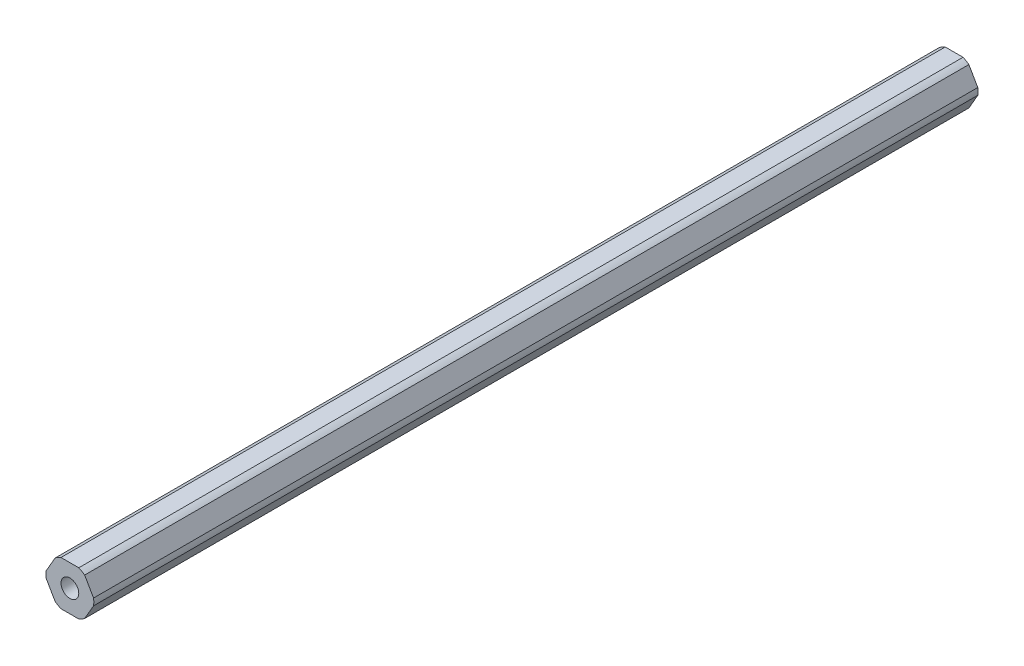
ISO-10303-21;
HEADER;
FILE_DESCRIPTION(('STEP AP214'),'2;1');
FILE_NAME('part.step','',(''),(''),'','','');
FILE_SCHEMA(('AUTOMOTIVE_DESIGN { 1 0 10303 214 1 1 1 1 }'));
ENDSEC;
DATA;
#1=APPLICATION_CONTEXT('core data for automotive mechanical design processes');
#2=APPLICATION_PROTOCOL_DEFINITION('international standard','automotive_design',2000,#1);
#3=PRODUCT_CONTEXT('',#1,'mechanical');
#4=PRODUCT('Part','Part','',(#3));
#5=PRODUCT_RELATED_PRODUCT_CATEGORY('part','',(#4));
#6=PRODUCT_DEFINITION_FORMATION('','',#4);
#7=PRODUCT_DEFINITION_CONTEXT('part definition',#1,'design');
#8=PRODUCT_DEFINITION('design','',#6,#7);
#9=PRODUCT_DEFINITION_SHAPE('','',#8);
#10=(LENGTH_UNIT() NAMED_UNIT(*) SI_UNIT(.MILLI.,.METRE.));
#11=(NAMED_UNIT(*) PLANE_ANGLE_UNIT() SI_UNIT($,.RADIAN.));
#12=(NAMED_UNIT(*) SI_UNIT($,.STERADIAN.) SOLID_ANGLE_UNIT());
#13=UNCERTAINTY_MEASURE_WITH_UNIT(LENGTH_MEASURE(1.E-05),#10,'distance_accuracy_value','');
#14=(GEOMETRIC_REPRESENTATION_CONTEXT(3) GLOBAL_UNCERTAINTY_ASSIGNED_CONTEXT((#13)) GLOBAL_UNIT_ASSIGNED_CONTEXT((#10,
#11,#12)) REPRESENTATION_CONTEXT('',''));
#15=CARTESIAN_POINT('',(0.,0.,0.));
#16=DIRECTION('',(0.,0.,1.));
#17=DIRECTION('',(1.,0.,0.));
#18=AXIS2_PLACEMENT_3D('',#15,#16,#17);
#19=CARTESIAN_POINT('',(0.,0.,-228.6));
#20=DIRECTION('',(0.,0.,1.));
#21=DIRECTION('',(1.,0.,0.));
#22=AXIS2_PLACEMENT_3D('',#19,#20,#21);
#23=CYLINDRICAL_SURFACE('',#22,6.87);
#24=CARTESIAN_POINT('',(0.,0.,-25.4));
#25=DIRECTION('',(0.,0.,1.));
#26=DIRECTION('',(1.,0.,0.));
#27=AXIS2_PLACEMENT_3D('',#24,#25,#26);
#28=CIRCLE('',#27,6.87);
#29=CARTESIAN_POINT('',(6.80102150534208,0.97108520937895,-25.4));
#30=VERTEX_POINT('',#29);
#31=CARTESIAN_POINT('',(6.80102150534208,-0.971085209378955,-25.4));
#32=VERTEX_POINT('',#31);
#33=EDGE_CURVE('E158',#30,#32,#28,.F.);
#34=ORIENTED_EDGE('',*,*,#33,.F.);
#35=DIRECTION('',(0.,0.,1.));
#36=VECTOR('',#35,1.);
#37=CARTESIAN_POINT('',(6.80102150534208,0.97108520937895,228.6));
#38=LINE('',#37,#36);
#39=CARTESIAN_POINT('',(6.80102150534208,0.971085209378948,228.6));
#40=VERTEX_POINT('',#39);
#41=EDGE_CURVE('E142',#30,#40,#38,.T.);
#42=ORIENTED_EDGE('',*,*,#41,.T.);
#43=CARTESIAN_POINT('',(0.,0.,228.6));
#44=DIRECTION('',(0.,0.,1.));
#45=DIRECTION('',(1.,0.,0.));
#46=AXIS2_PLACEMENT_3D('',#43,#44,#45);
#47=CIRCLE('',#46,6.87);
#48=CARTESIAN_POINT('',(6.80102150534208,-0.971085209378954,228.6));
#49=VERTEX_POINT('',#48);
#50=EDGE_CURVE('E178',#40,#49,#47,.F.);
#51=ORIENTED_EDGE('',*,*,#50,.T.);
#52=DIRECTION('',(0.,0.,1.));
#53=VECTOR('',#52,1.);
#54=CARTESIAN_POINT('',(6.80102150534208,-0.971085209378955,228.6));
#55=LINE('',#54,#53);
#56=EDGE_CURVE('E202',#49,#32,#55,.F.);
#57=ORIENTED_EDGE('',*,*,#56,.T.);
#58=EDGE_LOOP('',(#34,#42,#51,#57));
#59=FACE_BOUND('',#58,.T.);
#60=ADVANCED_FACE('F39',(#59),#23,.T.);
#61=CARTESIAN_POINT('',(3.68083890619154,6.3754,228.6));
#62=DIRECTION('',(0.,-1.,0.));
#63=DIRECTION('',(1.,0.,0.));
#64=AXIS2_PLACEMENT_3D('',#61,#62,#63);
#65=PLANE('',#64);
#66=DIRECTION('',(0.,0.,1.));
#67=VECTOR('',#66,1.);
#68=CARTESIAN_POINT('',(2.55952629210953,6.37540000000001,-228.6));
#69=LINE('',#68,#67);
#70=CARTESIAN_POINT('',(2.55952629210953,6.37540000000001,-25.4));
#71=VERTEX_POINT('',#70);
#72=CARTESIAN_POINT('',(2.55952629210953,6.37540000000001,228.6));
#73=VERTEX_POINT('',#72);
#74=EDGE_CURVE('E141',#71,#73,#69,.T.);
#75=ORIENTED_EDGE('',*,*,#74,.F.);
#76=DIRECTION('',(-1.,0.,0.));
#77=VECTOR('',#76,1.);
#78=CARTESIAN_POINT('',(3.68083890619154,6.3754,-25.4));
#79=LINE('',#78,#77);
#80=CARTESIAN_POINT('',(-2.55952629210953,6.37540000000001,-25.4));
#81=VERTEX_POINT('',#80);
#82=EDGE_CURVE('E55',#71,#81,#79,.T.);
#83=ORIENTED_EDGE('',*,*,#82,.T.);
#84=DIRECTION('',(0.,0.,1.));
#85=VECTOR('',#84,1.);
#86=CARTESIAN_POINT('',(-2.55952629210953,6.37540000000001,-228.6));
#87=LINE('',#86,#85);
#88=CARTESIAN_POINT('',(-2.55952629210953,6.37540000000001,228.6));
#89=VERTEX_POINT('',#88);
#90=EDGE_CURVE('E227',#89,#81,#87,.F.);
#91=ORIENTED_EDGE('',*,*,#90,.F.);
#92=DIRECTION('',(1.,0.,0.));
#93=VECTOR('',#92,1.);
#94=CARTESIAN_POINT('',(0.,6.3754,228.6));
#95=LINE('',#94,#93);
#96=EDGE_CURVE('E191',#73,#89,#95,.F.);
#97=ORIENTED_EDGE('',*,*,#96,.F.);
#98=EDGE_LOOP('',(#75,#83,#91,#97));
#99=FACE_BOUND('',#98,.T.);
#100=ADVANCED_FACE('F277',(#99),#65,.F.);
#101=CARTESIAN_POINT('',(0.,0.,-228.6));
#102=DIRECTION('',(0.,0.,1.));
#103=DIRECTION('',(1.,0.,0.));
#104=AXIS2_PLACEMENT_3D('',#101,#102,#103);
#105=CYLINDRICAL_SURFACE('',#104,6.87);
#106=CARTESIAN_POINT('',(0.,0.,-25.4));
#107=DIRECTION('',(0.,0.,1.));
#108=DIRECTION('',(1.,0.,0.));
#109=AXIS2_PLACEMENT_3D('',#106,#107,#108);
#110=CIRCLE('',#109,6.87);
#111=CARTESIAN_POINT('',(-4.24149521323255,5.40431479062104,-25.4));
#112=VERTEX_POINT('',#111);
#113=EDGE_CURVE('E62',#112,#81,#110,.F.);
#114=ORIENTED_EDGE('',*,*,#113,.F.);
#115=DIRECTION('',(0.,0.,1.));
#116=VECTOR('',#115,1.);
#117=CARTESIAN_POINT('',(-4.24149521323255,5.40431479062104,228.6));
#118=LINE('',#117,#116);
#119=CARTESIAN_POINT('',(-4.24149521323255,5.40431479062105,228.6));
#120=VERTEX_POINT('',#119);
#121=EDGE_CURVE('E224',#112,#120,#118,.T.);
#122=ORIENTED_EDGE('',*,*,#121,.T.);
#123=CARTESIAN_POINT('',(0.,0.,228.6));
#124=DIRECTION('',(0.,0.,1.));
#125=DIRECTION('',(1.,0.,0.));
#126=AXIS2_PLACEMENT_3D('',#123,#124,#125);
#127=CIRCLE('',#126,6.87);
#128=EDGE_CURVE('E190',#89,#120,#127,.T.);
#129=ORIENTED_EDGE('',*,*,#128,.F.);
#130=ORIENTED_EDGE('',*,*,#90,.T.);
#131=EDGE_LOOP('',(#114,#122,#129,#130));
#132=FACE_BOUND('',#131,.T.);
#133=ADVANCED_FACE('F275',(#132),#105,.T.);
#134=CARTESIAN_POINT('',(-3.68083890619154,6.3754,228.6));
#135=DIRECTION('',(0.866025403784439,-0.5,0.));
#136=DIRECTION('',(0.5,0.866025403784439,0.));
#137=AXIS2_PLACEMENT_3D('',#134,#135,#136);
#138=PLANE('',#137);
#139=ORIENTED_EDGE('',*,*,#121,.F.);
#140=DIRECTION('',(-0.5,-0.866025403784439,0.));
#141=VECTOR('',#140,1.);
#142=CARTESIAN_POINT('',(-3.68083890619154,6.3754,-25.4));
#143=LINE('',#142,#141);
#144=CARTESIAN_POINT('',(-6.80102150534208,0.971085209378959,-25.4));
#145=VERTEX_POINT('',#144);
#146=EDGE_CURVE('E175',#112,#145,#143,.T.);
#147=ORIENTED_EDGE('',*,*,#146,.T.);
#148=DIRECTION('',(0.,0.,1.));
#149=VECTOR('',#148,1.);
#150=CARTESIAN_POINT('',(-6.80102150534208,0.971085209378959,-228.6));
#151=LINE('',#150,#149);
#152=CARTESIAN_POINT('',(-6.80102150534208,0.971085209378961,228.6));
#153=VERTEX_POINT('',#152);
#154=EDGE_CURVE('E220',#153,#145,#151,.F.);
#155=ORIENTED_EDGE('',*,*,#154,.F.);
#156=DIRECTION('',(-0.5,-0.866025403784439,0.));
#157=VECTOR('',#156,1.);
#158=CARTESIAN_POINT('',(-4.24149521323255,5.40431479062104,228.6));
#159=LINE('',#158,#157);
#160=EDGE_CURVE('E188',#120,#153,#159,.T.);
#161=ORIENTED_EDGE('',*,*,#160,.F.);
#162=EDGE_LOOP('',(#139,#147,#155,#161));
#163=FACE_BOUND('',#162,.T.);
#164=ADVANCED_FACE('F273',(#163),#138,.F.);
#165=CARTESIAN_POINT('',(0.,0.,-228.6));
#166=DIRECTION('',(0.,0.,1.));
#167=DIRECTION('',(1.,0.,0.));
#168=AXIS2_PLACEMENT_3D('',#165,#166,#167);
#169=CYLINDRICAL_SURFACE('',#168,6.87);
#170=CARTESIAN_POINT('',(0.,0.,-25.4));
#171=DIRECTION('',(0.,0.,1.));
#172=DIRECTION('',(1.,0.,0.));
#173=AXIS2_PLACEMENT_3D('',#170,#171,#172);
#174=CIRCLE('',#173,6.87);
#175=CARTESIAN_POINT('',(-6.80102150534208,-0.971085209378956,-25.4));
#176=VERTEX_POINT('',#175);
#177=EDGE_CURVE('E172',#176,#145,#174,.F.);
#178=ORIENTED_EDGE('',*,*,#177,.F.);
#179=DIRECTION('',(0.,0.,1.));
#180=VECTOR('',#179,1.);
#181=CARTESIAN_POINT('',(-6.80102150534208,-0.971085209378956,228.6));
#182=LINE('',#181,#180);
#183=CARTESIAN_POINT('',(-6.80102150534208,-0.971085209378955,228.6));
#184=VERTEX_POINT('',#183);
#185=EDGE_CURVE('E217',#176,#184,#182,.T.);
#186=ORIENTED_EDGE('',*,*,#185,.T.);
#187=CARTESIAN_POINT('',(0.,0.,228.6));
#188=DIRECTION('',(0.,0.,1.));
#189=DIRECTION('',(1.,0.,0.));
#190=AXIS2_PLACEMENT_3D('',#187,#188,#189);
#191=CIRCLE('',#190,6.87);
#192=EDGE_CURVE('E187',#153,#184,#191,.T.);
#193=ORIENTED_EDGE('',*,*,#192,.F.);
#194=ORIENTED_EDGE('',*,*,#154,.T.);
#195=EDGE_LOOP('',(#178,#186,#193,#194));
#196=FACE_BOUND('',#195,.T.);
#197=ADVANCED_FACE('F269',(#196),#169,.T.);
#198=CARTESIAN_POINT('',(-7.36167781238308,0.,228.6));
#199=DIRECTION('',(0.866025403784439,0.5,0.));
#200=DIRECTION('',(-0.5,0.866025403784439,0.));
#201=AXIS2_PLACEMENT_3D('',#198,#199,#200);
#202=PLANE('',#201);
#203=ORIENTED_EDGE('',*,*,#185,.F.);
#204=DIRECTION('',(0.5,-0.866025403784439,0.));
#205=VECTOR('',#204,1.);
#206=CARTESIAN_POINT('',(-7.36167781238308,0.,-25.4));
#207=LINE('',#206,#205);
#208=CARTESIAN_POINT('',(-4.24149521323255,-5.40431479062105,-25.4));
#209=VERTEX_POINT('',#208);
#210=EDGE_CURVE('E170',#176,#209,#207,.T.);
#211=ORIENTED_EDGE('',*,*,#210,.T.);
#212=DIRECTION('',(0.,0.,1.));
#213=VECTOR('',#212,1.);
#214=CARTESIAN_POINT('',(-4.24149521323255,-5.40431479062105,-228.6));
#215=LINE('',#214,#213);
#216=CARTESIAN_POINT('',(-4.24149521323255,-5.40431479062105,228.6));
#217=VERTEX_POINT('',#216);
#218=EDGE_CURVE('E213',#217,#209,#215,.F.);
#219=ORIENTED_EDGE('',*,*,#218,.F.);
#220=DIRECTION('',(0.5,-0.866025403784439,0.));
#221=VECTOR('',#220,1.);
#222=CARTESIAN_POINT('',(-6.80102150534208,-0.971085209378956,228.6));
#223=LINE('',#222,#221);
#224=EDGE_CURVE('E185',#184,#217,#223,.T.);
#225=ORIENTED_EDGE('',*,*,#224,.F.);
#226=EDGE_LOOP('',(#203,#211,#219,#225));
#227=FACE_BOUND('',#226,.T.);
#228=ADVANCED_FACE('F267',(#227),#202,.F.);
#229=CARTESIAN_POINT('',(0.,0.,-228.6));
#230=DIRECTION('',(0.,0.,1.));
#231=DIRECTION('',(1.,0.,0.));
#232=AXIS2_PLACEMENT_3D('',#229,#230,#231);
#233=CYLINDRICAL_SURFACE('',#232,6.87);
#234=CARTESIAN_POINT('',(0.,0.,-25.4));
#235=DIRECTION('',(0.,0.,1.));
#236=DIRECTION('',(1.,0.,0.));
#237=AXIS2_PLACEMENT_3D('',#234,#235,#236);
#238=CIRCLE('',#237,6.87);
#239=CARTESIAN_POINT('',(-2.55952629210953,-6.3754,-25.4));
#240=VERTEX_POINT('',#239);
#241=EDGE_CURVE('E167',#240,#209,#238,.F.);
#242=ORIENTED_EDGE('',*,*,#241,.F.);
#243=DIRECTION('',(0.,0.,1.));
#244=VECTOR('',#243,1.);
#245=CARTESIAN_POINT('',(-2.55952629210953,-6.3754,228.6));
#246=LINE('',#245,#244);
#247=CARTESIAN_POINT('',(-2.55952629210953,-6.3754,228.6));
#248=VERTEX_POINT('',#247);
#249=EDGE_CURVE('E210',#240,#248,#246,.T.);
#250=ORIENTED_EDGE('',*,*,#249,.T.);
#251=CARTESIAN_POINT('',(0.,0.,228.6));
#252=DIRECTION('',(0.,0.,1.));
#253=DIRECTION('',(1.,0.,0.));
#254=AXIS2_PLACEMENT_3D('',#251,#252,#253);
#255=CIRCLE('',#254,6.87);
#256=EDGE_CURVE('E184',#217,#248,#255,.T.);
#257=ORIENTED_EDGE('',*,*,#256,.F.);
#258=ORIENTED_EDGE('',*,*,#218,.T.);
#259=EDGE_LOOP('',(#242,#250,#257,#258));
#260=FACE_BOUND('',#259,.T.);
#261=ADVANCED_FACE('F261',(#260),#233,.T.);
#262=CARTESIAN_POINT('',(-3.68083890619154,-6.3754,228.6));
#263=DIRECTION('',(0.,1.,0.));
#264=DIRECTION('',(0.,0.,1.));
#265=AXIS2_PLACEMENT_3D('',#262,#263,#264);
#266=PLANE('',#265);
#267=ORIENTED_EDGE('',*,*,#249,.F.);
#268=DIRECTION('',(1.,0.,0.));
#269=VECTOR('',#268,1.);
#270=CARTESIAN_POINT('',(-3.68083890619154,-6.3754,-25.4));
#271=LINE('',#270,#269);
#272=CARTESIAN_POINT('',(2.55952629210953,-6.3754,-25.4));
#273=VERTEX_POINT('',#272);
#274=EDGE_CURVE('E165',#240,#273,#271,.T.);
#275=ORIENTED_EDGE('',*,*,#274,.T.);
#276=DIRECTION('',(0.,0.,1.));
#277=VECTOR('',#276,1.);
#278=CARTESIAN_POINT('',(2.55952629210953,-6.3754,-228.6));
#279=LINE('',#278,#277);
#280=CARTESIAN_POINT('',(2.55952629210953,-6.3754,228.6));
#281=VERTEX_POINT('',#280);
#282=EDGE_CURVE('E206',#281,#273,#279,.F.);
#283=ORIENTED_EDGE('',*,*,#282,.F.);
#284=DIRECTION('',(1.,0.,0.));
#285=VECTOR('',#284,1.);
#286=CARTESIAN_POINT('',(0.,-6.3754,228.6));
#287=LINE('',#286,#285);
#288=EDGE_CURVE('E182',#248,#281,#287,.T.);
#289=ORIENTED_EDGE('',*,*,#288,.F.);
#290=EDGE_LOOP('',(#267,#275,#283,#289));
#291=FACE_BOUND('',#290,.T.);
#292=ADVANCED_FACE('F258',(#291),#266,.F.);
#293=CARTESIAN_POINT('',(0.,0.,-228.6));
#294=DIRECTION('',(0.,0.,1.));
#295=DIRECTION('',(1.,0.,0.));
#296=AXIS2_PLACEMENT_3D('',#293,#294,#295);
#297=CYLINDRICAL_SURFACE('',#296,6.87);
#298=CARTESIAN_POINT('',(0.,0.,-25.4));
#299=DIRECTION('',(0.,0.,1.));
#300=DIRECTION('',(1.,0.,0.));
#301=AXIS2_PLACEMENT_3D('',#298,#299,#300);
#302=CIRCLE('',#301,6.87);
#303=CARTESIAN_POINT('',(4.24149521323254,-5.40431479062105,-25.4));
#304=VERTEX_POINT('',#303);
#305=EDGE_CURVE('E162',#304,#273,#302,.F.);
#306=ORIENTED_EDGE('',*,*,#305,.F.);
#307=DIRECTION('',(0.,0.,1.));
#308=VECTOR('',#307,1.);
#309=CARTESIAN_POINT('',(4.24149521323254,-5.40431479062105,228.6));
#310=LINE('',#309,#308);
#311=CARTESIAN_POINT('',(4.24149521323254,-5.40431479062105,228.6));
#312=VERTEX_POINT('',#311);
#313=EDGE_CURVE('E199',#304,#312,#310,.T.);
#314=ORIENTED_EDGE('',*,*,#313,.T.);
#315=CARTESIAN_POINT('',(0.,0.,228.6));
#316=DIRECTION('',(0.,0.,1.));
#317=DIRECTION('',(1.,0.,0.));
#318=AXIS2_PLACEMENT_3D('',#315,#316,#317);
#319=CIRCLE('',#318,6.87);
#320=EDGE_CURVE('E181',#281,#312,#319,.T.);
#321=ORIENTED_EDGE('',*,*,#320,.F.);
#322=ORIENTED_EDGE('',*,*,#282,.T.);
#323=EDGE_LOOP('',(#306,#314,#321,#322));
#324=FACE_BOUND('',#323,.T.);
#325=ADVANCED_FACE('F253',(#324),#297,.T.);
#326=CARTESIAN_POINT('',(3.68083890619154,-6.3754,228.6));
#327=DIRECTION('',(-0.866025403784439,0.5,0.));
#328=DIRECTION('',(-0.5,-0.866025403784439,0.));
#329=AXIS2_PLACEMENT_3D('',#326,#327,#328);
#330=PLANE('',#329);
#331=ORIENTED_EDGE('',*,*,#313,.F.);
#332=DIRECTION('',(0.5,0.866025403784439,0.));
#333=VECTOR('',#332,1.);
#334=CARTESIAN_POINT('',(3.68083890619154,-6.3754,-25.4));
#335=LINE('',#334,#333);
#336=EDGE_CURVE('E160',#304,#32,#335,.T.);
#337=ORIENTED_EDGE('',*,*,#336,.T.);
#338=ORIENTED_EDGE('',*,*,#56,.F.);
#339=DIRECTION('',(0.5,0.866025403784439,0.));
#340=VECTOR('',#339,1.);
#341=CARTESIAN_POINT('',(4.24149521323254,-5.40431479062105,228.6));
#342=LINE('',#341,#340);
#343=EDGE_CURVE('E47',#312,#49,#342,.T.);
#344=ORIENTED_EDGE('',*,*,#343,.F.);
#345=EDGE_LOOP('',(#331,#337,#338,#344));
#346=FACE_BOUND('',#345,.T.);
#347=ADVANCED_FACE('F245',(#346),#330,.F.);
#348=CARTESIAN_POINT('',(7.36167781238308,0.,228.6));
#349=DIRECTION('',(-0.866025403784439,-0.5,0.));
#350=DIRECTION('',(0.5,-0.866025403784439,0.));
#351=AXIS2_PLACEMENT_3D('',#348,#349,#350);
#352=PLANE('',#351);
#353=ORIENTED_EDGE('',*,*,#41,.F.);
#354=DIRECTION('',(-0.5,0.866025403784439,0.));
#355=VECTOR('',#354,1.);
#356=CARTESIAN_POINT('',(7.36167781238308,0.,-25.4));
#357=LINE('',#356,#355);
#358=CARTESIAN_POINT('',(4.24149521323254,5.40431479062105,-25.4));
#359=VERTEX_POINT('',#358);
#360=EDGE_CURVE('E146',#30,#359,#357,.T.);
#361=ORIENTED_EDGE('',*,*,#360,.T.);
#362=DIRECTION('',(0.,0.,1.));
#363=VECTOR('',#362,1.);
#364=CARTESIAN_POINT('',(4.24149521323254,5.40431479062105,-228.6));
#365=LINE('',#364,#363);
#366=CARTESIAN_POINT('',(4.24149521323254,5.40431479062105,228.6));
#367=VERTEX_POINT('',#366);
#368=EDGE_CURVE('E131',#367,#359,#365,.F.);
#369=ORIENTED_EDGE('',*,*,#368,.F.);
#370=DIRECTION('',(-0.5,0.866025403784438,0.));
#371=VECTOR('',#370,1.);
#372=CARTESIAN_POINT('',(6.80102150534208,0.97108520937895,228.6));
#373=LINE('',#372,#371);
#374=EDGE_CURVE('E193',#40,#367,#373,.T.);
#375=ORIENTED_EDGE('',*,*,#374,.F.);
#376=EDGE_LOOP('',(#353,#361,#369,#375));
#377=FACE_BOUND('',#376,.T.);
#378=ADVANCED_FACE('F147',(#377),#352,.F.);
#379=CARTESIAN_POINT('',(0.,0.,-228.6));
#380=DIRECTION('',(0.,0.,1.));
#381=DIRECTION('',(1.,0.,0.));
#382=AXIS2_PLACEMENT_3D('',#379,#380,#381);
#383=CYLINDRICAL_SURFACE('',#382,6.87);
#384=CARTESIAN_POINT('',(0.,0.,-25.4));
#385=DIRECTION('',(0.,0.,1.));
#386=DIRECTION('',(1.,0.,0.));
#387=AXIS2_PLACEMENT_3D('',#384,#385,#386);
#388=CIRCLE('',#387,6.87);
#389=EDGE_CURVE('E135',#71,#359,#388,.F.);
#390=ORIENTED_EDGE('',*,*,#389,.F.);
#391=ORIENTED_EDGE('',*,*,#74,.T.);
#392=CARTESIAN_POINT('',(0.,0.,228.6));
#393=DIRECTION('',(0.,0.,1.));
#394=DIRECTION('',(1.,0.,0.));
#395=AXIS2_PLACEMENT_3D('',#392,#393,#394);
#396=CIRCLE('',#395,6.87);
#397=EDGE_CURVE('E137',#367,#73,#396,.T.);
#398=ORIENTED_EDGE('',*,*,#397,.F.);
#399=ORIENTED_EDGE('',*,*,#368,.T.);
#400=EDGE_LOOP('',(#390,#391,#398,#399));
#401=FACE_BOUND('',#400,.T.);
#402=ADVANCED_FACE('F133',(#401),#383,.T.);
#403=CARTESIAN_POINT('',(0.,0.,228.6));
#404=DIRECTION('',(0.,0.,1.));
#405=DIRECTION('',(1.,0.,0.));
#406=AXIS2_PLACEMENT_3D('',#403,#404,#405);
#407=PLANE('',#406);
#408=ORIENTED_EDGE('',*,*,#343,.T.);
#409=ORIENTED_EDGE('',*,*,#50,.F.);
#410=ORIENTED_EDGE('',*,*,#374,.T.);
#411=ORIENTED_EDGE('',*,*,#397,.T.);
#412=ORIENTED_EDGE('',*,*,#96,.T.);
#413=ORIENTED_EDGE('',*,*,#128,.T.);
#414=ORIENTED_EDGE('',*,*,#160,.T.);
#415=ORIENTED_EDGE('',*,*,#192,.T.);
#416=ORIENTED_EDGE('',*,*,#224,.T.);
#417=ORIENTED_EDGE('',*,*,#256,.T.);
#418=ORIENTED_EDGE('',*,*,#288,.T.);
#419=ORIENTED_EDGE('',*,*,#320,.T.);
#420=EDGE_LOOP('',(#408,#409,#410,#411,#412,#413,#414,#415,#416,#417,#418,#419));
#421=FACE_BOUND('',#420,.T.);
#422=CARTESIAN_POINT('',(0.,0.,228.6));
#423=DIRECTION('',(0.,0.,1.));
#424=DIRECTION('',(1.,0.,0.));
#425=AXIS2_PLACEMENT_3D('',#422,#423,#424);
#426=CIRCLE('',#425,2.55);
#427=CARTESIAN_POINT('',(2.55,0.,228.6));
#428=VERTEX_POINT('',#427);
#429=EDGE_CURVE('E12',#428,#428,#426,.F.);
#430=ORIENTED_EDGE('',*,*,#429,.T.);
#431=EDGE_LOOP('',(#430));
#432=FACE_BOUND('',#431,.T.);
#433=ADVANCED_FACE('F247',(#421,#432),#407,.T.);
#434=CARTESIAN_POINT('',(0.,0.,-228.6));
#435=DIRECTION('',(0.,0.,1.));
#436=DIRECTION('',(1.,0.,0.));
#437=AXIS2_PLACEMENT_3D('',#434,#435,#436);
#438=CYLINDRICAL_SURFACE('',#437,2.55);
#439=CARTESIAN_POINT('',(0.,0.,-25.4));
#440=DIRECTION('',(0.,0.,1.));
#441=DIRECTION('',(1.,0.,0.));
#442=AXIS2_PLACEMENT_3D('',#439,#440,#441);
#443=CIRCLE('',#442,2.55);
#444=CARTESIAN_POINT('',(2.55,0.,-25.4));
#445=VERTEX_POINT('',#444);
#446=EDGE_CURVE('E42',#445,#445,#443,.F.);
#447=ORIENTED_EDGE('',*,*,#446,.T.);
#448=EDGE_LOOP('',(#447));
#449=FACE_BOUND('',#448,.T.);
#450=ORIENTED_EDGE('',*,*,#429,.F.);
#451=EDGE_LOOP('',(#450));
#452=FACE_BOUND('',#451,.T.);
#453=ADVANCED_FACE('F285',(#449,#452),#438,.F.);
#454=CARTESIAN_POINT('',(0.,0.,-25.4));
#455=DIRECTION('',(0.,0.,1.));
#456=DIRECTION('',(1.,0.,0.));
#457=AXIS2_PLACEMENT_3D('',#454,#455,#456);
#458=PLANE('',#457);
#459=ORIENTED_EDGE('',*,*,#146,.F.);
#460=ORIENTED_EDGE('',*,*,#113,.T.);
#461=ORIENTED_EDGE('',*,*,#82,.F.);
#462=ORIENTED_EDGE('',*,*,#389,.T.);
#463=ORIENTED_EDGE('',*,*,#360,.F.);
#464=ORIENTED_EDGE('',*,*,#33,.T.);
#465=ORIENTED_EDGE('',*,*,#336,.F.);
#466=ORIENTED_EDGE('',*,*,#305,.T.);
#467=ORIENTED_EDGE('',*,*,#274,.F.);
#468=ORIENTED_EDGE('',*,*,#241,.T.);
#469=ORIENTED_EDGE('',*,*,#210,.F.);
#470=ORIENTED_EDGE('',*,*,#177,.T.);
#471=EDGE_LOOP('',(#459,#460,#461,#462,#463,#464,#465,#466,#467,#468,#469,#470));
#472=FACE_BOUND('',#471,.T.);
#473=ORIENTED_EDGE('',*,*,#446,.F.);
#474=EDGE_LOOP('',(#473));
#475=FACE_BOUND('',#474,.T.);
#476=ADVANCED_FACE('F152',(#472,#475),#458,.F.);
#477=CLOSED_SHELL('',(#60,#100,#133,#164,#197,#228,#261,#292,#325,#347,#378,#402,#433,#453,#476));
#478=MANIFOLD_SOLID_BREP('B2',#477);
#479=ADVANCED_BREP_SHAPE_REPRESENTATION('',(#18,#478),#14);
#480=SHAPE_DEFINITION_REPRESENTATION(#9,#479);
ENDSEC;
END-ISO-10303-21;
